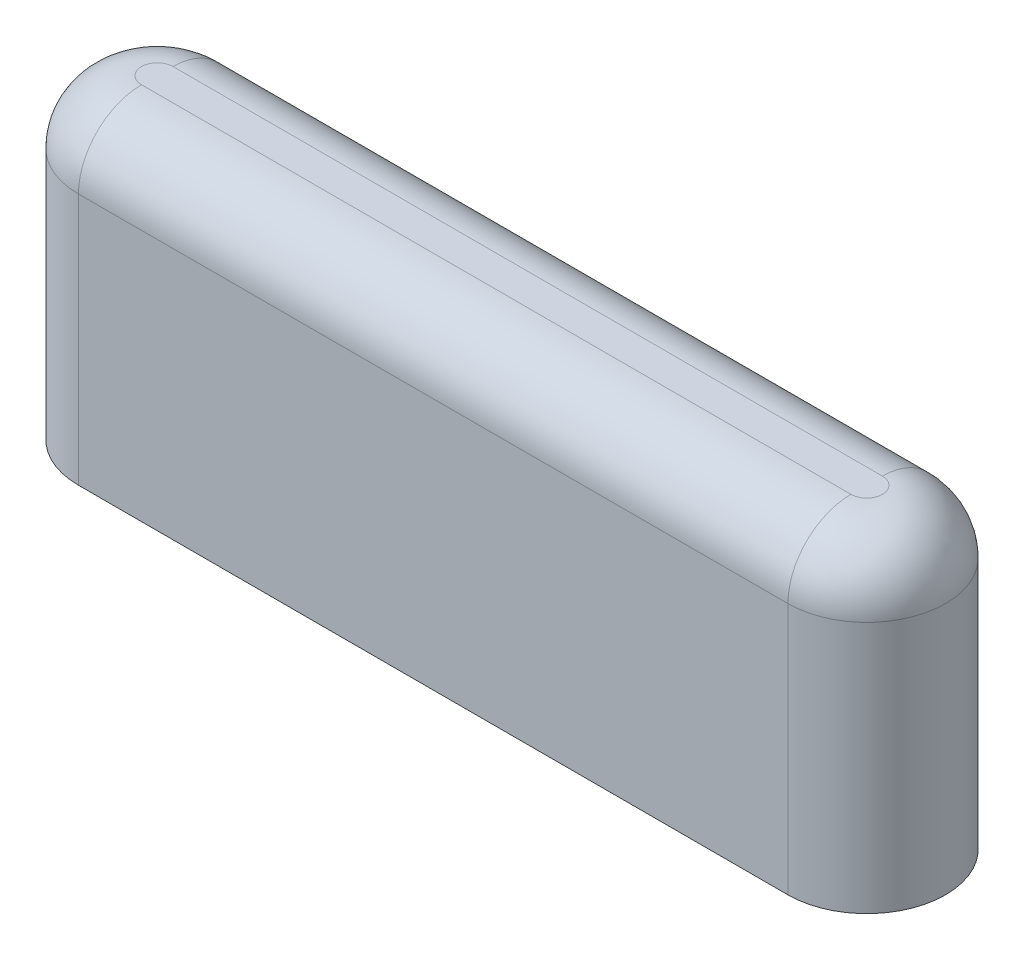
ISO-10303-21;
HEADER;
FILE_DESCRIPTION(('STEP AP214'),'2;1');
FILE_NAME('part.step','',(''),(''),'','','');
FILE_SCHEMA(('AUTOMOTIVE_DESIGN { 1 0 10303 214 1 1 1 1 }'));
ENDSEC;
DATA;
#1=APPLICATION_CONTEXT('core data for automotive mechanical design processes');
#2=APPLICATION_PROTOCOL_DEFINITION('international standard','automotive_design',2000,#1);
#3=PRODUCT_CONTEXT('',#1,'mechanical');
#4=PRODUCT('Part','Part','',(#3));
#5=PRODUCT_RELATED_PRODUCT_CATEGORY('part','',(#4));
#6=PRODUCT_DEFINITION_FORMATION('','',#4);
#7=PRODUCT_DEFINITION_CONTEXT('part definition',#1,'design');
#8=PRODUCT_DEFINITION('design','',#6,#7);
#9=PRODUCT_DEFINITION_SHAPE('','',#8);
#10=(LENGTH_UNIT() NAMED_UNIT(*) SI_UNIT(.MILLI.,.METRE.));
#11=(NAMED_UNIT(*) PLANE_ANGLE_UNIT() SI_UNIT($,.RADIAN.));
#12=(NAMED_UNIT(*) SI_UNIT($,.STERADIAN.) SOLID_ANGLE_UNIT());
#13=UNCERTAINTY_MEASURE_WITH_UNIT(LENGTH_MEASURE(1.E-05),#10,'distance_accuracy_value','');
#14=(GEOMETRIC_REPRESENTATION_CONTEXT(3) GLOBAL_UNCERTAINTY_ASSIGNED_CONTEXT((#13)) GLOBAL_UNIT_ASSIGNED_CONTEXT((#10,
#11,#12)) REPRESENTATION_CONTEXT('',''));
#15=CARTESIAN_POINT('',(0.,0.,0.));
#16=DIRECTION('',(0.,0.,1.));
#17=DIRECTION('',(1.,0.,0.));
#18=AXIS2_PLACEMENT_3D('',#15,#16,#17);
#19=CARTESIAN_POINT('',(22.5,20.,0.));
#20=DIRECTION('',(0.,-1.,0.));
#21=DIRECTION('',(0.,0.,-1.));
#22=AXIS2_PLACEMENT_3D('',#19,#20,#21);
#23=CYLINDRICAL_SURFACE('',#22,5.);
#24=DIRECTION('',(0.,-1.,0.));
#25=VECTOR('',#24,1.);
#26=CARTESIAN_POINT('',(22.5,20.,-5.));
#27=LINE('',#26,#25);
#28=CARTESIAN_POINT('',(22.5,16.,-5.));
#29=VERTEX_POINT('',#28);
#30=CARTESIAN_POINT('',(22.5,0.,-5.));
#31=VERTEX_POINT('',#30);
#32=EDGE_CURVE('E86',#29,#31,#27,.T.);
#33=ORIENTED_EDGE('',*,*,#32,.F.);
#34=CARTESIAN_POINT('',(22.5,16.,0.));
#35=DIRECTION('',(0.,1.,0.));
#36=DIRECTION('',(0.,0.,1.));
#37=AXIS2_PLACEMENT_3D('',#34,#35,#36);
#38=CIRCLE('',#37,5.);
#39=CARTESIAN_POINT('',(22.5,16.,5.));
#40=VERTEX_POINT('',#39);
#41=EDGE_CURVE('E132',#29,#40,#38,.F.);
#42=ORIENTED_EDGE('',*,*,#41,.T.);
#43=DIRECTION('',(0.,-1.,0.));
#44=VECTOR('',#43,1.);
#45=CARTESIAN_POINT('',(22.5,20.,5.));
#46=LINE('',#45,#44);
#47=CARTESIAN_POINT('',(22.5,0.,5.));
#48=VERTEX_POINT('',#47);
#49=EDGE_CURVE('E109',#40,#48,#46,.T.);
#50=ORIENTED_EDGE('',*,*,#49,.T.);
#51=CARTESIAN_POINT('',(22.5,0.,0.));
#52=DIRECTION('',(0.,1.,0.));
#53=DIRECTION('',(0.,0.,1.));
#54=AXIS2_PLACEMENT_3D('',#51,#52,#53);
#55=CIRCLE('',#54,5.);
#56=EDGE_CURVE('E104',#48,#31,#55,.T.);
#57=ORIENTED_EDGE('',*,*,#56,.T.);
#58=EDGE_LOOP('',(#33,#42,#50,#57));
#59=FACE_BOUND('',#58,.T.);
#60=ADVANCED_FACE('F33',(#59),#23,.T.);
#61=CARTESIAN_POINT('',(22.5,20.,-5.));
#62=DIRECTION('',(0.,0.,1.));
#63=DIRECTION('',(1.,0.,0.));
#64=AXIS2_PLACEMENT_3D('',#61,#62,#63);
#65=PLANE('',#64);
#66=DIRECTION('',(0.,-1.,0.));
#67=VECTOR('',#66,1.);
#68=CARTESIAN_POINT('',(-22.5,20.,-5.));
#69=LINE('',#68,#67);
#70=CARTESIAN_POINT('',(-22.5,16.,-5.));
#71=VERTEX_POINT('',#70);
#72=CARTESIAN_POINT('',(-22.5,0.,-5.));
#73=VERTEX_POINT('',#72);
#74=EDGE_CURVE('E98',#71,#73,#69,.T.);
#75=ORIENTED_EDGE('',*,*,#74,.F.);
#76=DIRECTION('',(-1.,0.,0.));
#77=VECTOR('',#76,1.);
#78=CARTESIAN_POINT('',(22.5,16.,-5.));
#79=LINE('',#78,#77);
#80=EDGE_CURVE('E92',#71,#29,#79,.F.);
#81=ORIENTED_EDGE('',*,*,#80,.T.);
#82=ORIENTED_EDGE('',*,*,#32,.T.);
#83=DIRECTION('',(-1.,0.,0.));
#84=VECTOR('',#83,1.);
#85=CARTESIAN_POINT('',(22.5,0.,-5.));
#86=LINE('',#85,#84);
#87=EDGE_CURVE('E89',#31,#73,#86,.T.);
#88=ORIENTED_EDGE('',*,*,#87,.T.);
#89=EDGE_LOOP('',(#75,#81,#82,#88));
#90=FACE_BOUND('',#89,.T.);
#91=ADVANCED_FACE('F88',(#90),#65,.F.);
#92=CARTESIAN_POINT('',(-22.5,20.,0.));
#93=DIRECTION('',(0.,-1.,0.));
#94=DIRECTION('',(0.,0.,-1.));
#95=AXIS2_PLACEMENT_3D('',#92,#93,#94);
#96=CYLINDRICAL_SURFACE('',#95,5.);
#97=DIRECTION('',(0.,-1.,0.));
#98=VECTOR('',#97,1.);
#99=CARTESIAN_POINT('',(-22.5,20.,5.));
#100=LINE('',#99,#98);
#101=CARTESIAN_POINT('',(-22.5,16.,5.));
#102=VERTEX_POINT('',#101);
#103=CARTESIAN_POINT('',(-22.5,0.,5.));
#104=VERTEX_POINT('',#103);
#105=EDGE_CURVE('E121',#102,#104,#100,.T.);
#106=ORIENTED_EDGE('',*,*,#105,.F.);
#107=CARTESIAN_POINT('',(-22.5,16.,0.));
#108=DIRECTION('',(0.,1.,0.));
#109=DIRECTION('',(0.,0.,1.));
#110=AXIS2_PLACEMENT_3D('',#107,#108,#109);
#111=CIRCLE('',#110,5.);
#112=EDGE_CURVE('E42',#102,#71,#111,.F.);
#113=ORIENTED_EDGE('',*,*,#112,.T.);
#114=ORIENTED_EDGE('',*,*,#74,.T.);
#115=CARTESIAN_POINT('',(-22.5,0.,0.));
#116=DIRECTION('',(0.,-1.,0.));
#117=DIRECTION('',(0.,0.,-1.));
#118=AXIS2_PLACEMENT_3D('',#115,#116,#117);
#119=CIRCLE('',#118,5.);
#120=EDGE_CURVE('E107',#104,#73,#119,.T.);
#121=ORIENTED_EDGE('',*,*,#120,.F.);
#122=EDGE_LOOP('',(#106,#113,#114,#121));
#123=FACE_BOUND('',#122,.T.);
#124=ADVANCED_FACE('F157',(#123),#96,.T.);
#125=CARTESIAN_POINT('',(22.5,20.,5.));
#126=DIRECTION('',(0.,0.,1.));
#127=DIRECTION('',(1.,0.,0.));
#128=AXIS2_PLACEMENT_3D('',#125,#126,#127);
#129=PLANE('',#128);
#130=ORIENTED_EDGE('',*,*,#49,.F.);
#131=DIRECTION('',(-1.,0.,0.));
#132=VECTOR('',#131,1.);
#133=CARTESIAN_POINT('',(22.5,16.,5.));
#134=LINE('',#133,#132);
#135=EDGE_CURVE('E11',#40,#102,#134,.T.);
#136=ORIENTED_EDGE('',*,*,#135,.T.);
#137=ORIENTED_EDGE('',*,*,#105,.T.);
#138=DIRECTION('',(-1.,0.,0.));
#139=VECTOR('',#138,1.);
#140=CARTESIAN_POINT('',(22.5,0.,5.));
#141=LINE('',#140,#139);
#142=EDGE_CURVE('E118',#48,#104,#141,.T.);
#143=ORIENTED_EDGE('',*,*,#142,.F.);
#144=EDGE_LOOP('',(#130,#136,#137,#143));
#145=FACE_BOUND('',#144,.T.);
#146=ADVANCED_FACE('F156',(#145),#129,.T.);
#147=CARTESIAN_POINT('',(22.5,20.,0.));
#148=DIRECTION('',(0.,1.,0.));
#149=DIRECTION('',(0.,0.,1.));
#150=AXIS2_PLACEMENT_3D('',#147,#148,#149);
#151=PLANE('',#150);
#152=DIRECTION('',(-1.,0.,0.));
#153=VECTOR('',#152,1.);
#154=CARTESIAN_POINT('',(22.5,20.,0.999999999999997));
#155=LINE('',#154,#153);
#156=CARTESIAN_POINT('',(-22.5,20.,1.));
#157=VERTEX_POINT('',#156);
#158=CARTESIAN_POINT('',(22.5,20.,0.999999999999997));
#159=VERTEX_POINT('',#158);
#160=EDGE_CURVE('E97',#157,#159,#155,.F.);
#161=ORIENTED_EDGE('',*,*,#160,.T.);
#162=CARTESIAN_POINT('',(22.5,20.,0.));
#163=DIRECTION('',(0.,1.,0.));
#164=DIRECTION('',(0.,0.,1.));
#165=AXIS2_PLACEMENT_3D('',#162,#163,#164);
#166=CIRCLE('',#165,1.);
#167=CARTESIAN_POINT('',(22.5,20.,-1.));
#168=VERTEX_POINT('',#167);
#169=EDGE_CURVE('E129',#159,#168,#166,.T.);
#170=ORIENTED_EDGE('',*,*,#169,.T.);
#171=DIRECTION('',(-1.,0.,0.));
#172=VECTOR('',#171,1.);
#173=CARTESIAN_POINT('',(-22.5,20.,-1.));
#174=LINE('',#173,#172);
#175=CARTESIAN_POINT('',(-22.5,20.,-1.));
#176=VERTEX_POINT('',#175);
#177=EDGE_CURVE('E127',#168,#176,#174,.T.);
#178=ORIENTED_EDGE('',*,*,#177,.T.);
#179=CARTESIAN_POINT('',(-22.5,20.,0.));
#180=DIRECTION('',(0.,1.,0.));
#181=DIRECTION('',(0.,0.,1.));
#182=AXIS2_PLACEMENT_3D('',#179,#180,#181);
#183=CIRCLE('',#182,1.);
#184=EDGE_CURVE('E125',#176,#157,#183,.T.);
#185=ORIENTED_EDGE('',*,*,#184,.T.);
#186=EDGE_LOOP('',(#161,#170,#178,#185));
#187=FACE_BOUND('',#186,.T.);
#188=ADVANCED_FACE('F151',(#187),#151,.T.);
#189=CARTESIAN_POINT('',(22.5,0.,0.));
#190=DIRECTION('',(0.,1.,0.));
#191=DIRECTION('',(0.,0.,1.));
#192=AXIS2_PLACEMENT_3D('',#189,#190,#191);
#193=PLANE('',#192);
#194=CARTESIAN_POINT('',(7.5,0.,0.));
#195=DIRECTION('',(0.,-1.,0.));
#196=DIRECTION('',(0.,0.,-1.));
#197=AXIS2_PLACEMENT_3D('',#194,#195,#196);
#198=CIRCLE('',#197,2.75);
#199=CARTESIAN_POINT('',(7.5,0.,-2.75));
#200=VERTEX_POINT('',#199);
#201=EDGE_CURVE('E212',#200,#200,#198,.T.);
#202=ORIENTED_EDGE('',*,*,#201,.F.);
#203=EDGE_LOOP('',(#202));
#204=FACE_BOUND('',#203,.T.);
#205=CARTESIAN_POINT('',(-22.5,0.,0.));
#206=DIRECTION('',(0.,-1.,0.));
#207=DIRECTION('',(0.,0.,-1.));
#208=AXIS2_PLACEMENT_3D('',#205,#206,#207);
#209=CIRCLE('',#208,2.75);
#210=CARTESIAN_POINT('',(-22.5,0.,-2.75));
#211=VERTEX_POINT('',#210);
#212=EDGE_CURVE('E114',#211,#211,#209,.T.);
#213=ORIENTED_EDGE('',*,*,#212,.F.);
#214=EDGE_LOOP('',(#213));
#215=FACE_BOUND('',#214,.T.);
#216=ORIENTED_EDGE('',*,*,#56,.F.);
#217=ORIENTED_EDGE('',*,*,#142,.T.);
#218=ORIENTED_EDGE('',*,*,#120,.T.);
#219=ORIENTED_EDGE('',*,*,#87,.F.);
#220=EDGE_LOOP('',(#216,#217,#218,#219));
#221=FACE_BOUND('',#220,.T.);
#222=ADVANCED_FACE('F102',(#204,#215,#221),#193,.F.);
#223=CARTESIAN_POINT('',(-22.5,16.,0.));
#224=DIRECTION('',(0.,1.,0.));
#225=DIRECTION('',(0.,0.,1.));
#226=AXIS2_PLACEMENT_3D('',#223,#224,#225);
#227=DEGENERATE_TOROIDAL_SURFACE('',#226,1.,4.,.T.);
#228=CARTESIAN_POINT('',(-22.5,16.,-1.));
#229=DIRECTION('',(1.,0.,0.));
#230=DIRECTION('',(0.,0.,-1.));
#231=AXIS2_PLACEMENT_3D('',#228,#229,#230);
#232=CIRCLE('',#231,4.);
#233=EDGE_CURVE('E112',#71,#176,#232,.T.);
#234=ORIENTED_EDGE('',*,*,#233,.F.);
#235=ORIENTED_EDGE('',*,*,#112,.F.);
#236=CARTESIAN_POINT('',(-22.5,16.,1.));
#237=DIRECTION('',(1.,0.,0.));
#238=DIRECTION('',(0.,0.,-1.));
#239=AXIS2_PLACEMENT_3D('',#236,#237,#238);
#240=CIRCLE('',#239,4.);
#241=EDGE_CURVE('E37',#157,#102,#240,.T.);
#242=ORIENTED_EDGE('',*,*,#241,.F.);
#243=ORIENTED_EDGE('',*,*,#184,.F.);
#244=EDGE_LOOP('',(#234,#235,#242,#243));
#245=FACE_BOUND('',#244,.T.);
#246=ADVANCED_FACE('F35',(#245),#227,.T.);
#247=CARTESIAN_POINT('',(22.5,16.,0.999999999999997));
#248=DIRECTION('',(-1.,0.,0.));
#249=DIRECTION('',(0.,0.,1.));
#250=AXIS2_PLACEMENT_3D('',#247,#248,#249);
#251=CYLINDRICAL_SURFACE('',#250,4.);
#252=ORIENTED_EDGE('',*,*,#241,.T.);
#253=ORIENTED_EDGE('',*,*,#135,.F.);
#254=CARTESIAN_POINT('',(22.5,16.,0.999999999999997));
#255=DIRECTION('',(1.,0.,0.));
#256=DIRECTION('',(0.,0.,-1.));
#257=AXIS2_PLACEMENT_3D('',#254,#255,#256);
#258=CIRCLE('',#257,4.);
#259=EDGE_CURVE('E138',#159,#40,#258,.T.);
#260=ORIENTED_EDGE('',*,*,#259,.F.);
#261=ORIENTED_EDGE('',*,*,#160,.F.);
#262=EDGE_LOOP('',(#252,#253,#260,#261));
#263=FACE_BOUND('',#262,.T.);
#264=ADVANCED_FACE('F175',(#263),#251,.T.);
#265=CARTESIAN_POINT('',(22.5,16.,-1.));
#266=DIRECTION('',(1.,0.,0.));
#267=DIRECTION('',(0.,0.,-1.));
#268=AXIS2_PLACEMENT_3D('',#265,#266,#267);
#269=CYLINDRICAL_SURFACE('',#268,4.);
#270=ORIENTED_EDGE('',*,*,#233,.T.);
#271=ORIENTED_EDGE('',*,*,#177,.F.);
#272=CARTESIAN_POINT('',(22.5,16.,-1.));
#273=DIRECTION('',(1.,0.,0.));
#274=DIRECTION('',(0.,0.,-1.));
#275=AXIS2_PLACEMENT_3D('',#272,#273,#274);
#276=CIRCLE('',#275,4.);
#277=EDGE_CURVE('E136',#29,#168,#276,.T.);
#278=ORIENTED_EDGE('',*,*,#277,.F.);
#279=ORIENTED_EDGE('',*,*,#80,.F.);
#280=EDGE_LOOP('',(#270,#271,#278,#279));
#281=FACE_BOUND('',#280,.T.);
#282=ADVANCED_FACE('F144',(#281),#269,.T.);
#283=CARTESIAN_POINT('',(22.5,16.,0.));
#284=DIRECTION('',(0.,1.,0.));
#285=DIRECTION('',(0.,0.,1.));
#286=AXIS2_PLACEMENT_3D('',#283,#284,#285);
#287=DEGENERATE_TOROIDAL_SURFACE('',#286,1.,4.,.T.);
#288=ORIENTED_EDGE('',*,*,#259,.T.);
#289=ORIENTED_EDGE('',*,*,#41,.F.);
#290=ORIENTED_EDGE('',*,*,#277,.T.);
#291=ORIENTED_EDGE('',*,*,#169,.F.);
#292=EDGE_LOOP('',(#288,#289,#290,#291));
#293=FACE_BOUND('',#292,.T.);
#294=ADVANCED_FACE('F155',(#293),#287,.T.);
#295=CARTESIAN_POINT('',(-22.5,1.5,0.));
#296=DIRECTION('',(0.,-1.,0.));
#297=DIRECTION('',(0.,0.,-1.));
#298=AXIS2_PLACEMENT_3D('',#295,#296,#297);
#299=CYLINDRICAL_SURFACE('',#298,2.75);
#300=CARTESIAN_POINT('',(-22.5,1.5,0.));
#301=DIRECTION('',(0.,-1.,0.));
#302=DIRECTION('',(0.,0.,-1.));
#303=AXIS2_PLACEMENT_3D('',#300,#301,#302);
#304=CIRCLE('',#303,2.75);
#305=CARTESIAN_POINT('',(-22.5,1.5,-2.75));
#306=VERTEX_POINT('',#305);
#307=EDGE_CURVE('E139',#306,#306,#304,.T.);
#308=ORIENTED_EDGE('',*,*,#307,.F.);
#309=EDGE_LOOP('',(#308));
#310=FACE_BOUND('',#309,.T.);
#311=ORIENTED_EDGE('',*,*,#212,.T.);
#312=EDGE_LOOP('',(#311));
#313=FACE_BOUND('',#312,.T.);
#314=ADVANCED_FACE('F173',(#310,#313),#299,.F.);
#315=CARTESIAN_POINT('',(-22.5,1.5,0.));
#316=DIRECTION('',(0.,-1.,0.));
#317=DIRECTION('',(0.,0.,-1.));
#318=AXIS2_PLACEMENT_3D('',#315,#316,#317);
#319=PLANE('',#318);
#320=ORIENTED_EDGE('',*,*,#307,.T.);
#321=EDGE_LOOP('',(#320));
#322=FACE_BOUND('',#321,.T.);
#323=ADVANCED_FACE('F195',(#322),#319,.T.);
#324=CARTESIAN_POINT('',(7.5,1.5,0.));
#325=DIRECTION('',(0.,-1.,0.));
#326=DIRECTION('',(0.,0.,-1.));
#327=AXIS2_PLACEMENT_3D('',#324,#325,#326);
#328=CYLINDRICAL_SURFACE('',#327,2.75);
#329=CARTESIAN_POINT('',(7.5,1.5,0.));
#330=DIRECTION('',(0.,-1.,0.));
#331=DIRECTION('',(0.,0.,-1.));
#332=AXIS2_PLACEMENT_3D('',#329,#330,#331);
#333=CIRCLE('',#332,2.75);
#334=CARTESIAN_POINT('',(7.5,1.5,-2.75));
#335=VERTEX_POINT('',#334);
#336=EDGE_CURVE('E211',#335,#335,#333,.T.);
#337=ORIENTED_EDGE('',*,*,#336,.F.);
#338=EDGE_LOOP('',(#337));
#339=FACE_BOUND('',#338,.T.);
#340=ORIENTED_EDGE('',*,*,#201,.T.);
#341=EDGE_LOOP('',(#340));
#342=FACE_BOUND('',#341,.T.);
#343=ADVANCED_FACE('F199',(#339,#342),#328,.F.);
#344=CARTESIAN_POINT('',(7.5,1.5,0.));
#345=DIRECTION('',(0.,-1.,0.));
#346=DIRECTION('',(0.,0.,-1.));
#347=AXIS2_PLACEMENT_3D('',#344,#345,#346);
#348=PLANE('',#347);
#349=ORIENTED_EDGE('',*,*,#336,.T.);
#350=EDGE_LOOP('',(#349));
#351=FACE_BOUND('',#350,.T.);
#352=ADVANCED_FACE('F203',(#351),#348,.T.);
#353=CLOSED_SHELL('',(#60,#91,#124,#146,#188,#222,#246,#264,#282,#294,#314,#323,#343,#352));
#354=MANIFOLD_SOLID_BREP('B2',#353);
#355=ADVANCED_BREP_SHAPE_REPRESENTATION('',(#18,#354),#14);
#356=SHAPE_DEFINITION_REPRESENTATION(#9,#355);
ENDSEC;
END-ISO-10303-21;
